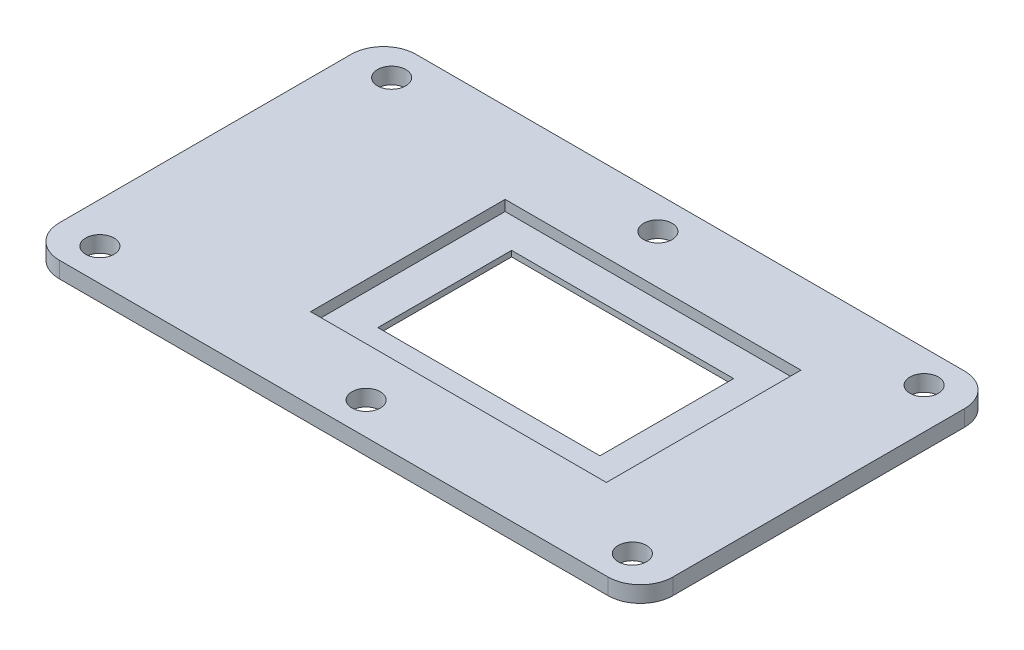
ISO-10303-21;
HEADER;
FILE_DESCRIPTION(('STEP AP214'),'2;1');
FILE_NAME('part.step','',(''),(''),'','','');
FILE_SCHEMA(('AUTOMOTIVE_DESIGN { 1 0 10303 214 1 1 1 1 }'));
ENDSEC;
DATA;
#1=APPLICATION_CONTEXT('core data for automotive mechanical design processes');
#2=APPLICATION_PROTOCOL_DEFINITION('international standard','automotive_design',2000,#1);
#3=PRODUCT_CONTEXT('',#1,'mechanical');
#4=PRODUCT('Part','Part','',(#3));
#5=PRODUCT_RELATED_PRODUCT_CATEGORY('part','',(#4));
#6=PRODUCT_DEFINITION_FORMATION('','',#4);
#7=PRODUCT_DEFINITION_CONTEXT('part definition',#1,'design');
#8=PRODUCT_DEFINITION('design','',#6,#7);
#9=PRODUCT_DEFINITION_SHAPE('','',#8);
#10=(LENGTH_UNIT() NAMED_UNIT(*) SI_UNIT(.MILLI.,.METRE.));
#11=(NAMED_UNIT(*) PLANE_ANGLE_UNIT() SI_UNIT($,.RADIAN.));
#12=(NAMED_UNIT(*) SI_UNIT($,.STERADIAN.) SOLID_ANGLE_UNIT());
#13=UNCERTAINTY_MEASURE_WITH_UNIT(LENGTH_MEASURE(1.E-05),#10,'distance_accuracy_value','');
#14=(GEOMETRIC_REPRESENTATION_CONTEXT(3) GLOBAL_UNCERTAINTY_ASSIGNED_CONTEXT((#13)) GLOBAL_UNIT_ASSIGNED_CONTEXT((#10,
#11,#12)) REPRESENTATION_CONTEXT('',''));
#15=CARTESIAN_POINT('',(0.,0.,0.));
#16=DIRECTION('',(0.,0.,1.));
#17=DIRECTION('',(1.,0.,0.));
#18=AXIS2_PLACEMENT_3D('',#15,#16,#17);
#19=CARTESIAN_POINT('',(0.,2.,-12.));
#20=DIRECTION('',(0.,0.,-1.));
#21=DIRECTION('',(-1.,0.,0.));
#22=AXIS2_PLACEMENT_3D('',#19,#20,#21);
#23=PLANE('',#22);
#24=DIRECTION('',(0.,-1.,0.));
#25=VECTOR('',#24,1.);
#26=CARTESIAN_POINT('',(-18.25,2.,-12.));
#27=LINE('',#26,#25);
#28=CARTESIAN_POINT('',(-18.25,2.,-12.));
#29=VERTEX_POINT('',#28);
#30=CARTESIAN_POINT('',(-18.25,0.7,-12.));
#31=VERTEX_POINT('',#30);
#32=EDGE_CURVE('E163',#29,#31,#27,.T.);
#33=ORIENTED_EDGE('',*,*,#32,.T.);
#34=DIRECTION('',(1.,0.,0.));
#35=VECTOR('',#34,1.);
#36=CARTESIAN_POINT('',(0.,0.7,-12.));
#37=LINE('',#36,#35);
#38=CARTESIAN_POINT('',(18.25,0.7,-12.));
#39=VERTEX_POINT('',#38);
#40=EDGE_CURVE('E54',#31,#39,#37,.T.);
#41=ORIENTED_EDGE('',*,*,#40,.T.);
#42=DIRECTION('',(0.,-1.,0.));
#43=VECTOR('',#42,1.);
#44=CARTESIAN_POINT('',(18.25,2.,-12.));
#45=LINE('',#44,#43);
#46=CARTESIAN_POINT('',(18.25,2.,-12.));
#47=VERTEX_POINT('',#46);
#48=EDGE_CURVE('E11',#47,#39,#45,.T.);
#49=ORIENTED_EDGE('',*,*,#48,.F.);
#50=DIRECTION('',(1.,0.,0.));
#51=VECTOR('',#50,1.);
#52=CARTESIAN_POINT('',(0.,2.,-12.));
#53=LINE('',#52,#51);
#54=EDGE_CURVE('E251',#29,#47,#53,.T.);
#55=ORIENTED_EDGE('',*,*,#54,.F.);
#56=EDGE_LOOP('',(#33,#41,#49,#55));
#57=FACE_BOUND('',#56,.T.);
#58=ADVANCED_FACE('F37',(#57),#23,.F.);
#59=CARTESIAN_POINT('',(18.25,2.,0.));
#60=DIRECTION('',(1.,0.,0.));
#61=DIRECTION('',(0.,0.,-1.));
#62=AXIS2_PLACEMENT_3D('',#59,#60,#61);
#63=PLANE('',#62);
#64=ORIENTED_EDGE('',*,*,#48,.T.);
#65=DIRECTION('',(0.,0.,1.));
#66=VECTOR('',#65,1.);
#67=CARTESIAN_POINT('',(18.25,0.7,0.));
#68=LINE('',#67,#66);
#69=CARTESIAN_POINT('',(18.25,0.7,12.));
#70=VERTEX_POINT('',#69);
#71=EDGE_CURVE('E60',#39,#70,#68,.T.);
#72=ORIENTED_EDGE('',*,*,#71,.T.);
#73=DIRECTION('',(0.,-1.,0.));
#74=VECTOR('',#73,1.);
#75=CARTESIAN_POINT('',(18.25,2.,12.));
#76=LINE('',#75,#74);
#77=CARTESIAN_POINT('',(18.25,2.,12.));
#78=VERTEX_POINT('',#77);
#79=EDGE_CURVE('E46',#78,#70,#76,.T.);
#80=ORIENTED_EDGE('',*,*,#79,.F.);
#81=DIRECTION('',(0.,0.,1.));
#82=VECTOR('',#81,1.);
#83=CARTESIAN_POINT('',(18.25,2.,0.));
#84=LINE('',#83,#82);
#85=EDGE_CURVE('E254',#47,#78,#84,.T.);
#86=ORIENTED_EDGE('',*,*,#85,.F.);
#87=EDGE_LOOP('',(#64,#72,#80,#86));
#88=FACE_BOUND('',#87,.T.);
#89=ADVANCED_FACE('F358',(#88),#63,.F.);
#90=CARTESIAN_POINT('',(0.,2.,12.));
#91=DIRECTION('',(0.,0.,-1.));
#92=DIRECTION('',(-1.,0.,0.));
#93=AXIS2_PLACEMENT_3D('',#90,#91,#92);
#94=PLANE('',#93);
#95=DIRECTION('',(1.,0.,0.));
#96=VECTOR('',#95,1.);
#97=CARTESIAN_POINT('',(0.,0.7,12.));
#98=LINE('',#97,#96);
#99=CARTESIAN_POINT('',(-18.25,0.7,12.));
#100=VERTEX_POINT('',#99);
#101=EDGE_CURVE('E166',#100,#70,#98,.T.);
#102=ORIENTED_EDGE('',*,*,#101,.F.);
#103=DIRECTION('',(0.,-1.,0.));
#104=VECTOR('',#103,1.);
#105=CARTESIAN_POINT('',(-18.25,2.,12.));
#106=LINE('',#105,#104);
#107=CARTESIAN_POINT('',(-18.25,2.,12.));
#108=VERTEX_POINT('',#107);
#109=EDGE_CURVE('E153',#108,#100,#106,.T.);
#110=ORIENTED_EDGE('',*,*,#109,.F.);
#111=DIRECTION('',(1.,0.,0.));
#112=VECTOR('',#111,1.);
#113=CARTESIAN_POINT('',(0.,2.,12.));
#114=LINE('',#113,#112);
#115=EDGE_CURVE('E256',#108,#78,#114,.T.);
#116=ORIENTED_EDGE('',*,*,#115,.T.);
#117=ORIENTED_EDGE('',*,*,#79,.T.);
#118=EDGE_LOOP('',(#102,#110,#116,#117));
#119=FACE_BOUND('',#118,.T.);
#120=ADVANCED_FACE('F167',(#119),#94,.T.);
#121=CARTESIAN_POINT('',(0.,2.,-22.));
#122=DIRECTION('',(0.,0.,-1.));
#123=DIRECTION('',(-1.,0.,0.));
#124=AXIS2_PLACEMENT_3D('',#121,#122,#123);
#125=PLANE('',#124);
#126=DIRECTION('',(1.,0.,0.));
#127=VECTOR('',#126,1.);
#128=CARTESIAN_POINT('',(0.,0.,-22.));
#129=LINE('',#128,#127);
#130=CARTESIAN_POINT('',(-39.25,0.,-22.));
#131=VERTEX_POINT('',#130);
#132=CARTESIAN_POINT('',(28.45,0.,-22.));
#133=VERTEX_POINT('',#132);
#134=EDGE_CURVE('E277',#131,#133,#129,.T.);
#135=ORIENTED_EDGE('',*,*,#134,.F.);
#136=DIRECTION('',(0.,-1.,0.));
#137=VECTOR('',#136,1.);
#138=CARTESIAN_POINT('',(-39.25,2.,-22.));
#139=LINE('',#138,#137);
#140=CARTESIAN_POINT('',(-39.25,2.,-22.));
#141=VERTEX_POINT('',#140);
#142=EDGE_CURVE('E41',#141,#131,#139,.T.);
#143=ORIENTED_EDGE('',*,*,#142,.F.);
#144=DIRECTION('',(1.,0.,0.));
#145=VECTOR('',#144,1.);
#146=CARTESIAN_POINT('',(0.,2.,-22.));
#147=LINE('',#146,#145);
#148=CARTESIAN_POINT('',(28.45,2.,-22.));
#149=VERTEX_POINT('',#148);
#150=EDGE_CURVE('E228',#141,#149,#147,.T.);
#151=ORIENTED_EDGE('',*,*,#150,.T.);
#152=DIRECTION('',(0.,-1.,0.));
#153=VECTOR('',#152,1.);
#154=CARTESIAN_POINT('',(28.45,2.,-22.));
#155=LINE('',#154,#153);
#156=EDGE_CURVE('E259',#149,#133,#155,.T.);
#157=ORIENTED_EDGE('',*,*,#156,.T.);
#158=EDGE_LOOP('',(#135,#143,#151,#157));
#159=FACE_BOUND('',#158,.T.);
#160=ADVANCED_FACE('F330',(#159),#125,.T.);
#161=CARTESIAN_POINT('',(-39.25,2.,-18.));
#162=DIRECTION('',(0.,-1.,0.));
#163=DIRECTION('',(0.,0.,-1.));
#164=AXIS2_PLACEMENT_3D('',#161,#162,#163);
#165=CYLINDRICAL_SURFACE('',#164,4.);
#166=CARTESIAN_POINT('',(-39.25,0.,-18.));
#167=DIRECTION('',(0.,1.,0.));
#168=DIRECTION('',(0.,0.,1.));
#169=AXIS2_PLACEMENT_3D('',#166,#167,#168);
#170=CIRCLE('',#169,4.);
#171=CARTESIAN_POINT('',(-43.25,0.,-18.));
#172=VERTEX_POINT('',#171);
#173=EDGE_CURVE('E280',#131,#172,#170,.T.);
#174=ORIENTED_EDGE('',*,*,#173,.T.);
#175=DIRECTION('',(0.,-1.,0.));
#176=VECTOR('',#175,1.);
#177=CARTESIAN_POINT('',(-43.25,2.,-18.));
#178=LINE('',#177,#176);
#179=CARTESIAN_POINT('',(-43.25,2.,-18.));
#180=VERTEX_POINT('',#179);
#181=EDGE_CURVE('E315',#180,#172,#178,.T.);
#182=ORIENTED_EDGE('',*,*,#181,.F.);
#183=CARTESIAN_POINT('',(-39.25,2.,-18.));
#184=DIRECTION('',(0.,1.,0.));
#185=DIRECTION('',(0.,0.,1.));
#186=AXIS2_PLACEMENT_3D('',#183,#184,#185);
#187=CIRCLE('',#186,4.);
#188=EDGE_CURVE('E231',#141,#180,#187,.T.);
#189=ORIENTED_EDGE('',*,*,#188,.F.);
#190=ORIENTED_EDGE('',*,*,#142,.T.);
#191=EDGE_LOOP('',(#174,#182,#189,#190));
#192=FACE_BOUND('',#191,.T.);
#193=ADVANCED_FACE('F322',(#192),#165,.T.);
#194=CARTESIAN_POINT('',(-43.25,2.,0.));
#195=DIRECTION('',(1.,0.,0.));
#196=DIRECTION('',(0.,0.,-1.));
#197=AXIS2_PLACEMENT_3D('',#194,#195,#196);
#198=PLANE('',#197);
#199=DIRECTION('',(0.,0.,1.));
#200=VECTOR('',#199,1.);
#201=CARTESIAN_POINT('',(-43.25,0.,0.));
#202=LINE('',#201,#200);
#203=CARTESIAN_POINT('',(-43.25,0.,18.));
#204=VERTEX_POINT('',#203);
#205=EDGE_CURVE('E283',#172,#204,#202,.T.);
#206=ORIENTED_EDGE('',*,*,#205,.T.);
#207=DIRECTION('',(0.,-1.,0.));
#208=VECTOR('',#207,1.);
#209=CARTESIAN_POINT('',(-43.25,2.,18.));
#210=LINE('',#209,#208);
#211=CARTESIAN_POINT('',(-43.25,2.,18.));
#212=VERTEX_POINT('',#211);
#213=EDGE_CURVE('E313',#212,#204,#210,.T.);
#214=ORIENTED_EDGE('',*,*,#213,.F.);
#215=DIRECTION('',(0.,0.,1.));
#216=VECTOR('',#215,1.);
#217=CARTESIAN_POINT('',(-43.25,2.,0.));
#218=LINE('',#217,#216);
#219=EDGE_CURVE('E234',#180,#212,#218,.T.);
#220=ORIENTED_EDGE('',*,*,#219,.F.);
#221=ORIENTED_EDGE('',*,*,#181,.T.);
#222=EDGE_LOOP('',(#206,#214,#220,#221));
#223=FACE_BOUND('',#222,.T.);
#224=ADVANCED_FACE('F348',(#223),#198,.F.);
#225=CARTESIAN_POINT('',(-39.25,2.,18.));
#226=DIRECTION('',(0.,-1.,0.));
#227=DIRECTION('',(0.,0.,-1.));
#228=AXIS2_PLACEMENT_3D('',#225,#226,#227);
#229=CYLINDRICAL_SURFACE('',#228,4.);
#230=CARTESIAN_POINT('',(-39.25,0.,18.));
#231=DIRECTION('',(0.,1.,0.));
#232=DIRECTION('',(0.,0.,1.));
#233=AXIS2_PLACEMENT_3D('',#230,#231,#232);
#234=CIRCLE('',#233,4.);
#235=CARTESIAN_POINT('',(-39.25,0.,22.));
#236=VERTEX_POINT('',#235);
#237=EDGE_CURVE('E286',#204,#236,#234,.T.);
#238=ORIENTED_EDGE('',*,*,#237,.T.);
#239=DIRECTION('',(0.,-1.,0.));
#240=VECTOR('',#239,1.);
#241=CARTESIAN_POINT('',(-39.25,2.,22.));
#242=LINE('',#241,#240);
#243=CARTESIAN_POINT('',(-39.25,2.,22.));
#244=VERTEX_POINT('',#243);
#245=EDGE_CURVE('E310',#244,#236,#242,.T.);
#246=ORIENTED_EDGE('',*,*,#245,.F.);
#247=CARTESIAN_POINT('',(-39.25,2.,18.));
#248=DIRECTION('',(0.,1.,0.));
#249=DIRECTION('',(0.,0.,1.));
#250=AXIS2_PLACEMENT_3D('',#247,#248,#249);
#251=CIRCLE('',#250,4.);
#252=EDGE_CURVE('E237',#212,#244,#251,.T.);
#253=ORIENTED_EDGE('',*,*,#252,.F.);
#254=ORIENTED_EDGE('',*,*,#213,.T.);
#255=EDGE_LOOP('',(#238,#246,#253,#254));
#256=FACE_BOUND('',#255,.T.);
#257=ADVANCED_FACE('F347',(#256),#229,.T.);
#258=CARTESIAN_POINT('',(0.,2.,22.));
#259=DIRECTION('',(0.,0.,-1.));
#260=DIRECTION('',(-1.,0.,0.));
#261=AXIS2_PLACEMENT_3D('',#258,#259,#260);
#262=PLANE('',#261);
#263=DIRECTION('',(1.,0.,0.));
#264=VECTOR('',#263,1.);
#265=CARTESIAN_POINT('',(0.,0.,22.));
#266=LINE('',#265,#264);
#267=CARTESIAN_POINT('',(28.45,0.,22.));
#268=VERTEX_POINT('',#267);
#269=EDGE_CURVE('E289',#236,#268,#266,.T.);
#270=ORIENTED_EDGE('',*,*,#269,.T.);
#271=DIRECTION('',(0.,-1.,0.));
#272=VECTOR('',#271,1.);
#273=CARTESIAN_POINT('',(28.45,2.,22.));
#274=LINE('',#273,#272);
#275=CARTESIAN_POINT('',(28.45,2.,22.));
#276=VERTEX_POINT('',#275);
#277=EDGE_CURVE('E307',#276,#268,#274,.T.);
#278=ORIENTED_EDGE('',*,*,#277,.F.);
#279=DIRECTION('',(1.,0.,0.));
#280=VECTOR('',#279,1.);
#281=CARTESIAN_POINT('',(0.,2.,22.));
#282=LINE('',#281,#280);
#283=EDGE_CURVE('E240',#244,#276,#282,.T.);
#284=ORIENTED_EDGE('',*,*,#283,.F.);
#285=ORIENTED_EDGE('',*,*,#245,.T.);
#286=EDGE_LOOP('',(#270,#278,#284,#285));
#287=FACE_BOUND('',#286,.T.);
#288=ADVANCED_FACE('F343',(#287),#262,.F.);
#289=CARTESIAN_POINT('',(28.45,2.,18.));
#290=DIRECTION('',(0.,-1.,0.));
#291=DIRECTION('',(0.,0.,-1.));
#292=AXIS2_PLACEMENT_3D('',#289,#290,#291);
#293=CYLINDRICAL_SURFACE('',#292,4.);
#294=CARTESIAN_POINT('',(28.45,0.,18.));
#295=DIRECTION('',(0.,1.,0.));
#296=DIRECTION('',(0.,0.,1.));
#297=AXIS2_PLACEMENT_3D('',#294,#295,#296);
#298=CIRCLE('',#297,4.);
#299=CARTESIAN_POINT('',(32.45,0.,17.9999999999999));
#300=VERTEX_POINT('',#299);
#301=EDGE_CURVE('E292',#268,#300,#298,.T.);
#302=ORIENTED_EDGE('',*,*,#301,.T.);
#303=DIRECTION('',(0.,-1.,0.));
#304=VECTOR('',#303,1.);
#305=CARTESIAN_POINT('',(32.45,2.,17.9999999999999));
#306=LINE('',#305,#304);
#307=CARTESIAN_POINT('',(32.45,2.,17.9999999999999));
#308=VERTEX_POINT('',#307);
#309=EDGE_CURVE('E305',#308,#300,#306,.T.);
#310=ORIENTED_EDGE('',*,*,#309,.F.);
#311=CARTESIAN_POINT('',(28.45,2.,18.));
#312=DIRECTION('',(0.,1.,0.));
#313=DIRECTION('',(0.,0.,1.));
#314=AXIS2_PLACEMENT_3D('',#311,#312,#313);
#315=CIRCLE('',#314,4.);
#316=EDGE_CURVE('E243',#276,#308,#315,.T.);
#317=ORIENTED_EDGE('',*,*,#316,.F.);
#318=ORIENTED_EDGE('',*,*,#277,.T.);
#319=EDGE_LOOP('',(#302,#310,#317,#318));
#320=FACE_BOUND('',#319,.T.);
#321=ADVANCED_FACE('F340',(#320),#293,.T.);
#322=CARTESIAN_POINT('',(32.45,2.,0.));
#323=DIRECTION('',(1.,0.,0.));
#324=DIRECTION('',(0.,0.,-1.));
#325=AXIS2_PLACEMENT_3D('',#322,#323,#324);
#326=PLANE('',#325);
#327=DIRECTION('',(0.,0.,1.));
#328=VECTOR('',#327,1.);
#329=CARTESIAN_POINT('',(32.45,0.,0.));
#330=LINE('',#329,#328);
#331=CARTESIAN_POINT('',(32.45,0.,-18.));
#332=VERTEX_POINT('',#331);
#333=EDGE_CURVE('E295',#332,#300,#330,.T.);
#334=ORIENTED_EDGE('',*,*,#333,.F.);
#335=DIRECTION('',(0.,-1.,0.));
#336=VECTOR('',#335,1.);
#337=CARTESIAN_POINT('',(32.45,2.,-18.));
#338=LINE('',#337,#336);
#339=CARTESIAN_POINT('',(32.45,2.,-18.));
#340=VERTEX_POINT('',#339);
#341=EDGE_CURVE('E303',#340,#332,#338,.T.);
#342=ORIENTED_EDGE('',*,*,#341,.F.);
#343=DIRECTION('',(0.,0.,1.));
#344=VECTOR('',#343,1.);
#345=CARTESIAN_POINT('',(32.45,2.,0.));
#346=LINE('',#345,#344);
#347=EDGE_CURVE('E245',#340,#308,#346,.T.);
#348=ORIENTED_EDGE('',*,*,#347,.T.);
#349=ORIENTED_EDGE('',*,*,#309,.T.);
#350=EDGE_LOOP('',(#334,#342,#348,#349));
#351=FACE_BOUND('',#350,.T.);
#352=ADVANCED_FACE('F336',(#351),#326,.T.);
#353=CARTESIAN_POINT('',(28.45,2.,-18.));
#354=DIRECTION('',(0.,-1.,0.));
#355=DIRECTION('',(0.,0.,-1.));
#356=AXIS2_PLACEMENT_3D('',#353,#354,#355);
#357=CYLINDRICAL_SURFACE('',#356,4.);
#358=CARTESIAN_POINT('',(28.45,0.,-18.));
#359=DIRECTION('',(0.,1.,0.));
#360=DIRECTION('',(0.,0.,1.));
#361=AXIS2_PLACEMENT_3D('',#358,#359,#360);
#362=CIRCLE('',#361,4.);
#363=EDGE_CURVE('E213',#133,#332,#362,.F.);
#364=ORIENTED_EDGE('',*,*,#363,.F.);
#365=ORIENTED_EDGE('',*,*,#156,.F.);
#366=CARTESIAN_POINT('',(28.45,2.,-18.));
#367=DIRECTION('',(0.,1.,0.));
#368=DIRECTION('',(0.,0.,1.));
#369=AXIS2_PLACEMENT_3D('',#366,#367,#368);
#370=CIRCLE('',#369,4.);
#371=EDGE_CURVE('E248',#149,#340,#370,.F.);
#372=ORIENTED_EDGE('',*,*,#371,.T.);
#373=ORIENTED_EDGE('',*,*,#341,.T.);
#374=EDGE_LOOP('',(#364,#365,#372,#373));
#375=FACE_BOUND('',#374,.T.);
#376=ADVANCED_FACE('F333',(#375),#357,.T.);
#377=CARTESIAN_POINT('',(-5.4,2.,18.));
#378=DIRECTION('',(0.,-1.,0.));
#379=DIRECTION('',(0.,0.,-1.));
#380=AXIS2_PLACEMENT_3D('',#377,#378,#379);
#381=CYLINDRICAL_SURFACE('',#380,1.75000000000001);
#382=CARTESIAN_POINT('',(-5.4,2.,18.));
#383=DIRECTION('',(0.,1.,0.));
#384=DIRECTION('',(0.,0.,1.));
#385=AXIS2_PLACEMENT_3D('',#382,#383,#384);
#386=CIRCLE('',#385,1.75000000000001);
#387=CARTESIAN_POINT('',(-5.4,2.,19.75));
#388=VERTEX_POINT('',#387);
#389=EDGE_CURVE('E225',#388,#388,#386,.F.);
#390=ORIENTED_EDGE('',*,*,#389,.F.);
#391=EDGE_LOOP('',(#390));
#392=FACE_BOUND('',#391,.T.);
#393=CARTESIAN_POINT('',(-5.4,0.,18.));
#394=DIRECTION('',(0.,1.,0.));
#395=DIRECTION('',(0.,0.,1.));
#396=AXIS2_PLACEMENT_3D('',#393,#394,#395);
#397=CIRCLE('',#396,1.75000000000001);
#398=CARTESIAN_POINT('',(-5.4,0.,19.75));
#399=VERTEX_POINT('',#398);
#400=EDGE_CURVE('E274',#399,#399,#397,.F.);
#401=ORIENTED_EDGE('',*,*,#400,.T.);
#402=EDGE_LOOP('',(#401));
#403=FACE_BOUND('',#402,.T.);
#404=ADVANCED_FACE('F368',(#392,#403),#381,.F.);
#405=CARTESIAN_POINT('',(27.45,2.,18.));
#406=DIRECTION('',(0.,-1.,0.));
#407=DIRECTION('',(0.,0.,-1.));
#408=AXIS2_PLACEMENT_3D('',#405,#406,#407);
#409=CYLINDRICAL_SURFACE('',#408,1.75);
#410=CARTESIAN_POINT('',(27.45,2.,18.));
#411=DIRECTION('',(0.,1.,0.));
#412=DIRECTION('',(0.,0.,1.));
#413=AXIS2_PLACEMENT_3D('',#410,#411,#412);
#414=CIRCLE('',#413,1.75);
#415=CARTESIAN_POINT('',(27.45,2.,19.75));
#416=VERTEX_POINT('',#415);
#417=EDGE_CURVE('E222',#416,#416,#414,.T.);
#418=ORIENTED_EDGE('',*,*,#417,.T.);
#419=EDGE_LOOP('',(#418));
#420=FACE_BOUND('',#419,.T.);
#421=CARTESIAN_POINT('',(27.45,0.,18.));
#422=DIRECTION('',(0.,1.,0.));
#423=DIRECTION('',(0.,0.,1.));
#424=AXIS2_PLACEMENT_3D('',#421,#422,#423);
#425=CIRCLE('',#424,1.75);
#426=CARTESIAN_POINT('',(27.45,0.,19.75));
#427=VERTEX_POINT('',#426);
#428=EDGE_CURVE('E271',#427,#427,#425,.T.);
#429=ORIENTED_EDGE('',*,*,#428,.F.);
#430=EDGE_LOOP('',(#429));
#431=FACE_BOUND('',#430,.T.);
#432=ADVANCED_FACE('F396',(#420,#431),#409,.F.);
#433=CARTESIAN_POINT('',(-5.4,2.,-18.));
#434=DIRECTION('',(0.,-1.,0.));
#435=DIRECTION('',(0.,0.,-1.));
#436=AXIS2_PLACEMENT_3D('',#433,#434,#435);
#437=CYLINDRICAL_SURFACE('',#436,1.75);
#438=CARTESIAN_POINT('',(-5.4,2.,-18.));
#439=DIRECTION('',(0.,1.,0.));
#440=DIRECTION('',(0.,0.,1.));
#441=AXIS2_PLACEMENT_3D('',#438,#439,#440);
#442=CIRCLE('',#441,1.75);
#443=CARTESIAN_POINT('',(-5.4,2.,-16.25));
#444=VERTEX_POINT('',#443);
#445=EDGE_CURVE('E219',#444,#444,#442,.T.);
#446=ORIENTED_EDGE('',*,*,#445,.T.);
#447=EDGE_LOOP('',(#446));
#448=FACE_BOUND('',#447,.T.);
#449=CARTESIAN_POINT('',(-5.4,0.,-18.));
#450=DIRECTION('',(0.,1.,0.));
#451=DIRECTION('',(0.,0.,1.));
#452=AXIS2_PLACEMENT_3D('',#449,#450,#451);
#453=CIRCLE('',#452,1.75);
#454=CARTESIAN_POINT('',(-5.4,0.,-16.25));
#455=VERTEX_POINT('',#454);
#456=EDGE_CURVE('E268',#455,#455,#453,.T.);
#457=ORIENTED_EDGE('',*,*,#456,.F.);
#458=EDGE_LOOP('',(#457));
#459=FACE_BOUND('',#458,.T.);
#460=ADVANCED_FACE('F404',(#448,#459),#437,.F.);
#461=CARTESIAN_POINT('',(-38.25,2.,-18.));
#462=DIRECTION('',(0.,-1.,0.));
#463=DIRECTION('',(0.,0.,-1.));
#464=AXIS2_PLACEMENT_3D('',#461,#462,#463);
#465=CYLINDRICAL_SURFACE('',#464,1.75);
#466=CARTESIAN_POINT('',(-38.25,2.,-18.));
#467=DIRECTION('',(0.,1.,0.));
#468=DIRECTION('',(0.,0.,1.));
#469=AXIS2_PLACEMENT_3D('',#466,#467,#468);
#470=CIRCLE('',#469,1.75);
#471=CARTESIAN_POINT('',(-38.25,2.,-16.25));
#472=VERTEX_POINT('',#471);
#473=EDGE_CURVE('E216',#472,#472,#470,.T.);
#474=ORIENTED_EDGE('',*,*,#473,.T.);
#475=EDGE_LOOP('',(#474));
#476=FACE_BOUND('',#475,.T.);
#477=CARTESIAN_POINT('',(-38.25,0.,-18.));
#478=DIRECTION('',(0.,1.,0.));
#479=DIRECTION('',(0.,0.,1.));
#480=AXIS2_PLACEMENT_3D('',#477,#478,#479);
#481=CIRCLE('',#480,1.75);
#482=CARTESIAN_POINT('',(-38.25,0.,-16.25));
#483=VERTEX_POINT('',#482);
#484=EDGE_CURVE('E265',#483,#483,#481,.T.);
#485=ORIENTED_EDGE('',*,*,#484,.F.);
#486=EDGE_LOOP('',(#485));
#487=FACE_BOUND('',#486,.T.);
#488=ADVANCED_FACE('F412',(#476,#487),#465,.F.);
#489=CARTESIAN_POINT('',(27.45,2.,-18.));
#490=DIRECTION('',(0.,-1.,0.));
#491=DIRECTION('',(0.,0.,-1.));
#492=AXIS2_PLACEMENT_3D('',#489,#490,#491);
#493=CYLINDRICAL_SURFACE('',#492,1.75);
#494=CARTESIAN_POINT('',(27.45,2.,-18.));
#495=DIRECTION('',(0.,1.,0.));
#496=DIRECTION('',(0.,0.,1.));
#497=AXIS2_PLACEMENT_3D('',#494,#495,#496);
#498=CIRCLE('',#497,1.75);
#499=CARTESIAN_POINT('',(27.45,2.,-16.25));
#500=VERTEX_POINT('',#499);
#501=EDGE_CURVE('E212',#500,#500,#498,.F.);
#502=ORIENTED_EDGE('',*,*,#501,.F.);
#503=EDGE_LOOP('',(#502));
#504=FACE_BOUND('',#503,.T.);
#505=CARTESIAN_POINT('',(27.45,0.,-18.));
#506=DIRECTION('',(0.,1.,0.));
#507=DIRECTION('',(0.,0.,1.));
#508=AXIS2_PLACEMENT_3D('',#505,#506,#507);
#509=CIRCLE('',#508,1.75);
#510=CARTESIAN_POINT('',(27.45,0.,-16.25));
#511=VERTEX_POINT('',#510);
#512=EDGE_CURVE('E262',#511,#511,#509,.F.);
#513=ORIENTED_EDGE('',*,*,#512,.T.);
#514=EDGE_LOOP('',(#513));
#515=FACE_BOUND('',#514,.T.);
#516=ADVANCED_FACE('F420',(#504,#515),#493,.F.);
#517=CARTESIAN_POINT('',(-38.25,2.,18.));
#518=DIRECTION('',(0.,-1.,0.));
#519=DIRECTION('',(0.,0.,-1.));
#520=AXIS2_PLACEMENT_3D('',#517,#518,#519);
#521=CYLINDRICAL_SURFACE('',#520,1.75);
#522=CARTESIAN_POINT('',(-38.25,2.,18.));
#523=DIRECTION('',(0.,1.,0.));
#524=DIRECTION('',(0.,0.,1.));
#525=AXIS2_PLACEMENT_3D('',#522,#523,#524);
#526=CIRCLE('',#525,1.75);
#527=CARTESIAN_POINT('',(-38.25,2.,19.75));
#528=VERTEX_POINT('',#527);
#529=EDGE_CURVE('E209',#528,#528,#526,.F.);
#530=ORIENTED_EDGE('',*,*,#529,.F.);
#531=EDGE_LOOP('',(#530));
#532=FACE_BOUND('',#531,.T.);
#533=CARTESIAN_POINT('',(-38.25,0.,18.));
#534=DIRECTION('',(0.,1.,0.));
#535=DIRECTION('',(0.,0.,1.));
#536=AXIS2_PLACEMENT_3D('',#533,#534,#535);
#537=CIRCLE('',#536,1.75);
#538=CARTESIAN_POINT('',(-38.25,0.,19.75));
#539=VERTEX_POINT('',#538);
#540=EDGE_CURVE('E208',#539,#539,#537,.F.);
#541=ORIENTED_EDGE('',*,*,#540,.T.);
#542=EDGE_LOOP('',(#541));
#543=FACE_BOUND('',#542,.T.);
#544=ADVANCED_FACE('F39',(#532,#543),#521,.F.);
#545=CARTESIAN_POINT('',(-18.25,2.,0.));
#546=DIRECTION('',(1.,0.,0.));
#547=DIRECTION('',(0.,0.,-1.));
#548=AXIS2_PLACEMENT_3D('',#545,#546,#547);
#549=PLANE('',#548);
#550=DIRECTION('',(0.,0.,1.));
#551=VECTOR('',#550,1.);
#552=CARTESIAN_POINT('',(-18.25,0.7,0.));
#553=LINE('',#552,#551);
#554=EDGE_CURVE('E157',#31,#100,#553,.T.);
#555=ORIENTED_EDGE('',*,*,#554,.F.);
#556=ORIENTED_EDGE('',*,*,#32,.F.);
#557=DIRECTION('',(0.,0.,1.));
#558=VECTOR('',#557,1.);
#559=CARTESIAN_POINT('',(-18.25,2.,0.));
#560=LINE('',#559,#558);
#561=EDGE_CURVE('E159',#29,#108,#560,.T.);
#562=ORIENTED_EDGE('',*,*,#561,.T.);
#563=ORIENTED_EDGE('',*,*,#109,.T.);
#564=EDGE_LOOP('',(#555,#556,#562,#563));
#565=FACE_BOUND('',#564,.T.);
#566=ADVANCED_FACE('F155',(#565),#549,.T.);
#567=CARTESIAN_POINT('',(0.,2.,0.));
#568=DIRECTION('',(0.,1.,0.));
#569=DIRECTION('',(0.,0.,1.));
#570=AXIS2_PLACEMENT_3D('',#567,#568,#569);
#571=PLANE('',#570);
#572=ORIENTED_EDGE('',*,*,#529,.T.);
#573=EDGE_LOOP('',(#572));
#574=FACE_BOUND('',#573,.T.);
#575=ORIENTED_EDGE('',*,*,#501,.T.);
#576=EDGE_LOOP('',(#575));
#577=FACE_BOUND('',#576,.T.);
#578=ORIENTED_EDGE('',*,*,#473,.F.);
#579=EDGE_LOOP('',(#578));
#580=FACE_BOUND('',#579,.T.);
#581=ORIENTED_EDGE('',*,*,#445,.F.);
#582=EDGE_LOOP('',(#581));
#583=FACE_BOUND('',#582,.T.);
#584=ORIENTED_EDGE('',*,*,#417,.F.);
#585=EDGE_LOOP('',(#584));
#586=FACE_BOUND('',#585,.T.);
#587=ORIENTED_EDGE('',*,*,#389,.T.);
#588=EDGE_LOOP('',(#587));
#589=FACE_BOUND('',#588,.T.);
#590=ORIENTED_EDGE('',*,*,#150,.F.);
#591=ORIENTED_EDGE('',*,*,#188,.T.);
#592=ORIENTED_EDGE('',*,*,#219,.T.);
#593=ORIENTED_EDGE('',*,*,#252,.T.);
#594=ORIENTED_EDGE('',*,*,#283,.T.);
#595=ORIENTED_EDGE('',*,*,#316,.T.);
#596=ORIENTED_EDGE('',*,*,#347,.F.);
#597=ORIENTED_EDGE('',*,*,#371,.F.);
#598=EDGE_LOOP('',(#590,#591,#592,#593,#594,#595,#596,#597));
#599=FACE_BOUND('',#598,.T.);
#600=ORIENTED_EDGE('',*,*,#54,.T.);
#601=ORIENTED_EDGE('',*,*,#85,.T.);
#602=ORIENTED_EDGE('',*,*,#115,.F.);
#603=ORIENTED_EDGE('',*,*,#561,.F.);
#604=EDGE_LOOP('',(#600,#601,#602,#603));
#605=FACE_BOUND('',#604,.T.);
#606=ADVANCED_FACE('F441',(#574,#577,#580,#583,#586,#589,#599,#605),#571,.T.);
#607=CARTESIAN_POINT('',(0.,0.,0.));
#608=DIRECTION('',(0.,1.,0.));
#609=DIRECTION('',(0.,0.,1.));
#610=AXIS2_PLACEMENT_3D('',#607,#608,#609);
#611=PLANE('',#610);
#612=ORIENTED_EDGE('',*,*,#540,.F.);
#613=EDGE_LOOP('',(#612));
#614=FACE_BOUND('',#613,.T.);
#615=ORIENTED_EDGE('',*,*,#512,.F.);
#616=EDGE_LOOP('',(#615));
#617=FACE_BOUND('',#616,.T.);
#618=ORIENTED_EDGE('',*,*,#484,.T.);
#619=EDGE_LOOP('',(#618));
#620=FACE_BOUND('',#619,.T.);
#621=ORIENTED_EDGE('',*,*,#456,.T.);
#622=EDGE_LOOP('',(#621));
#623=FACE_BOUND('',#622,.T.);
#624=ORIENTED_EDGE('',*,*,#428,.T.);
#625=EDGE_LOOP('',(#624));
#626=FACE_BOUND('',#625,.T.);
#627=ORIENTED_EDGE('',*,*,#400,.F.);
#628=EDGE_LOOP('',(#627));
#629=FACE_BOUND('',#628,.T.);
#630=ORIENTED_EDGE('',*,*,#134,.T.);
#631=ORIENTED_EDGE('',*,*,#363,.T.);
#632=ORIENTED_EDGE('',*,*,#333,.T.);
#633=ORIENTED_EDGE('',*,*,#301,.F.);
#634=ORIENTED_EDGE('',*,*,#269,.F.);
#635=ORIENTED_EDGE('',*,*,#237,.F.);
#636=ORIENTED_EDGE('',*,*,#205,.F.);
#637=ORIENTED_EDGE('',*,*,#173,.F.);
#638=EDGE_LOOP('',(#630,#631,#632,#633,#634,#635,#636,#637));
#639=FACE_BOUND('',#638,.T.);
#640=DIRECTION('',(0.,0.,-1.));
#641=VECTOR('',#640,1.);
#642=CARTESIAN_POINT('',(13.7,0.,0.));
#643=LINE('',#642,#641);
#644=CARTESIAN_POINT('',(13.7,0.,8.25));
#645=VERTEX_POINT('',#644);
#646=CARTESIAN_POINT('',(13.7,0.,-8.25));
#647=VERTEX_POINT('',#646);
#648=EDGE_CURVE('E188',#645,#647,#643,.T.);
#649=ORIENTED_EDGE('',*,*,#648,.T.);
#650=DIRECTION('',(1.,0.,0.));
#651=VECTOR('',#650,1.);
#652=CARTESIAN_POINT('',(0.,0.,-8.25));
#653=LINE('',#652,#651);
#654=CARTESIAN_POINT('',(-13.7,0.,-8.25));
#655=VERTEX_POINT('',#654);
#656=EDGE_CURVE('E197',#655,#647,#653,.T.);
#657=ORIENTED_EDGE('',*,*,#656,.F.);
#658=DIRECTION('',(0.,0.,-1.));
#659=VECTOR('',#658,1.);
#660=CARTESIAN_POINT('',(-13.7,0.,0.));
#661=LINE('',#660,#659);
#662=CARTESIAN_POINT('',(-13.7,0.,8.25));
#663=VERTEX_POINT('',#662);
#664=EDGE_CURVE('E194',#663,#655,#661,.T.);
#665=ORIENTED_EDGE('',*,*,#664,.F.);
#666=DIRECTION('',(1.,0.,0.));
#667=VECTOR('',#666,1.);
#668=CARTESIAN_POINT('',(0.,0.,8.25));
#669=LINE('',#668,#667);
#670=EDGE_CURVE('E191',#663,#645,#669,.T.);
#671=ORIENTED_EDGE('',*,*,#670,.T.);
#672=EDGE_LOOP('',(#649,#657,#665,#671));
#673=FACE_BOUND('',#672,.T.);
#674=ADVANCED_FACE('F327',(#614,#617,#620,#623,#626,#629,#639,#673),#611,.F.);
#675=CARTESIAN_POINT('',(13.7,0.7,0.));
#676=DIRECTION('',(-1.,0.,0.));
#677=DIRECTION('',(0.,0.,1.));
#678=AXIS2_PLACEMENT_3D('',#675,#676,#677);
#679=PLANE('',#678);
#680=ORIENTED_EDGE('',*,*,#648,.F.);
#681=DIRECTION('',(0.,-1.,0.));
#682=VECTOR('',#681,1.);
#683=CARTESIAN_POINT('',(13.7,0.7,8.25));
#684=LINE('',#683,#682);
#685=CARTESIAN_POINT('',(13.7,0.7,8.25));
#686=VERTEX_POINT('',#685);
#687=EDGE_CURVE('E206',#686,#645,#684,.T.);
#688=ORIENTED_EDGE('',*,*,#687,.F.);
#689=DIRECTION('',(0.,0.,-1.));
#690=VECTOR('',#689,1.);
#691=CARTESIAN_POINT('',(13.7,0.7,0.));
#692=LINE('',#691,#690);
#693=CARTESIAN_POINT('',(13.7,0.7,-8.25));
#694=VERTEX_POINT('',#693);
#695=EDGE_CURVE('E169',#686,#694,#692,.T.);
#696=ORIENTED_EDGE('',*,*,#695,.T.);
#697=DIRECTION('',(0.,-1.,0.));
#698=VECTOR('',#697,1.);
#699=CARTESIAN_POINT('',(13.7,0.7,-8.25));
#700=LINE('',#699,#698);
#701=EDGE_CURVE('E187',#694,#647,#700,.T.);
#702=ORIENTED_EDGE('',*,*,#701,.T.);
#703=EDGE_LOOP('',(#680,#688,#696,#702));
#704=FACE_BOUND('',#703,.T.);
#705=ADVANCED_FACE('F455',(#704),#679,.T.);
#706=CARTESIAN_POINT('',(0.,0.7,8.25));
#707=DIRECTION('',(0.,0.,-1.));
#708=DIRECTION('',(-1.,0.,0.));
#709=AXIS2_PLACEMENT_3D('',#706,#707,#708);
#710=PLANE('',#709);
#711=ORIENTED_EDGE('',*,*,#670,.F.);
#712=DIRECTION('',(0.,-1.,0.));
#713=VECTOR('',#712,1.);
#714=CARTESIAN_POINT('',(-13.7,0.7,8.25));
#715=LINE('',#714,#713);
#716=CARTESIAN_POINT('',(-13.7,0.7,8.25));
#717=VERTEX_POINT('',#716);
#718=EDGE_CURVE('E204',#717,#663,#715,.T.);
#719=ORIENTED_EDGE('',*,*,#718,.F.);
#720=DIRECTION('',(1.,0.,0.));
#721=VECTOR('',#720,1.);
#722=CARTESIAN_POINT('',(0.,0.7,8.25));
#723=LINE('',#722,#721);
#724=EDGE_CURVE('E179',#717,#686,#723,.T.);
#725=ORIENTED_EDGE('',*,*,#724,.T.);
#726=ORIENTED_EDGE('',*,*,#687,.T.);
#727=EDGE_LOOP('',(#711,#719,#725,#726));
#728=FACE_BOUND('',#727,.T.);
#729=ADVANCED_FACE('F463',(#728),#710,.T.);
#730=CARTESIAN_POINT('',(-13.7,0.7,0.));
#731=DIRECTION('',(-1.,0.,0.));
#732=DIRECTION('',(0.,0.,1.));
#733=AXIS2_PLACEMENT_3D('',#730,#731,#732);
#734=PLANE('',#733);
#735=ORIENTED_EDGE('',*,*,#664,.T.);
#736=DIRECTION('',(0.,-1.,0.));
#737=VECTOR('',#736,1.);
#738=CARTESIAN_POINT('',(-13.7,0.7,-8.25));
#739=LINE('',#738,#737);
#740=CARTESIAN_POINT('',(-13.7,0.7,-8.25));
#741=VERTEX_POINT('',#740);
#742=EDGE_CURVE('E201',#741,#655,#739,.T.);
#743=ORIENTED_EDGE('',*,*,#742,.F.);
#744=DIRECTION('',(0.,0.,-1.));
#745=VECTOR('',#744,1.);
#746=CARTESIAN_POINT('',(-13.7,0.7,0.));
#747=LINE('',#746,#745);
#748=EDGE_CURVE('E182',#717,#741,#747,.T.);
#749=ORIENTED_EDGE('',*,*,#748,.F.);
#750=ORIENTED_EDGE('',*,*,#718,.T.);
#751=EDGE_LOOP('',(#735,#743,#749,#750));
#752=FACE_BOUND('',#751,.T.);
#753=ADVANCED_FACE('F471',(#752),#734,.F.);
#754=CARTESIAN_POINT('',(0.,0.7,-8.25));
#755=DIRECTION('',(0.,0.,-1.));
#756=DIRECTION('',(-1.,0.,0.));
#757=AXIS2_PLACEMENT_3D('',#754,#755,#756);
#758=PLANE('',#757);
#759=ORIENTED_EDGE('',*,*,#656,.T.);
#760=ORIENTED_EDGE('',*,*,#701,.F.);
#761=DIRECTION('',(1.,0.,0.));
#762=VECTOR('',#761,1.);
#763=CARTESIAN_POINT('',(0.,0.7,-8.25));
#764=LINE('',#763,#762);
#765=EDGE_CURVE('E185',#741,#694,#764,.T.);
#766=ORIENTED_EDGE('',*,*,#765,.F.);
#767=ORIENTED_EDGE('',*,*,#742,.T.);
#768=EDGE_LOOP('',(#759,#760,#766,#767));
#769=FACE_BOUND('',#768,.T.);
#770=ADVANCED_FACE('F479',(#769),#758,.F.);
#771=CARTESIAN_POINT('',(0.,0.7,0.));
#772=DIRECTION('',(0.,1.,0.));
#773=DIRECTION('',(0.,0.,1.));
#774=AXIS2_PLACEMENT_3D('',#771,#772,#773);
#775=PLANE('',#774);
#776=ORIENTED_EDGE('',*,*,#71,.F.);
#777=ORIENTED_EDGE('',*,*,#40,.F.);
#778=ORIENTED_EDGE('',*,*,#554,.T.);
#779=ORIENTED_EDGE('',*,*,#101,.T.);
#780=EDGE_LOOP('',(#776,#777,#778,#779));
#781=FACE_BOUND('',#780,.T.);
#782=ORIENTED_EDGE('',*,*,#695,.F.);
#783=ORIENTED_EDGE('',*,*,#724,.F.);
#784=ORIENTED_EDGE('',*,*,#748,.T.);
#785=ORIENTED_EDGE('',*,*,#765,.T.);
#786=EDGE_LOOP('',(#782,#783,#784,#785));
#787=FACE_BOUND('',#786,.T.);
#788=ADVANCED_FACE('F171',(#781,#787),#775,.T.);
#789=CLOSED_SHELL('',(#58,#89,#120,#160,#193,#224,#257,#288,#321,#352,#376,#404,#432,#460,#488,
#516,#544,#566,#606,#674,#705,#729,#753,#770,#788));
#790=MANIFOLD_SOLID_BREP('B2',#789);
#791=ADVANCED_BREP_SHAPE_REPRESENTATION('',(#18,#790),#14);
#792=SHAPE_DEFINITION_REPRESENTATION(#9,#791);
ENDSEC;
END-ISO-10303-21;
